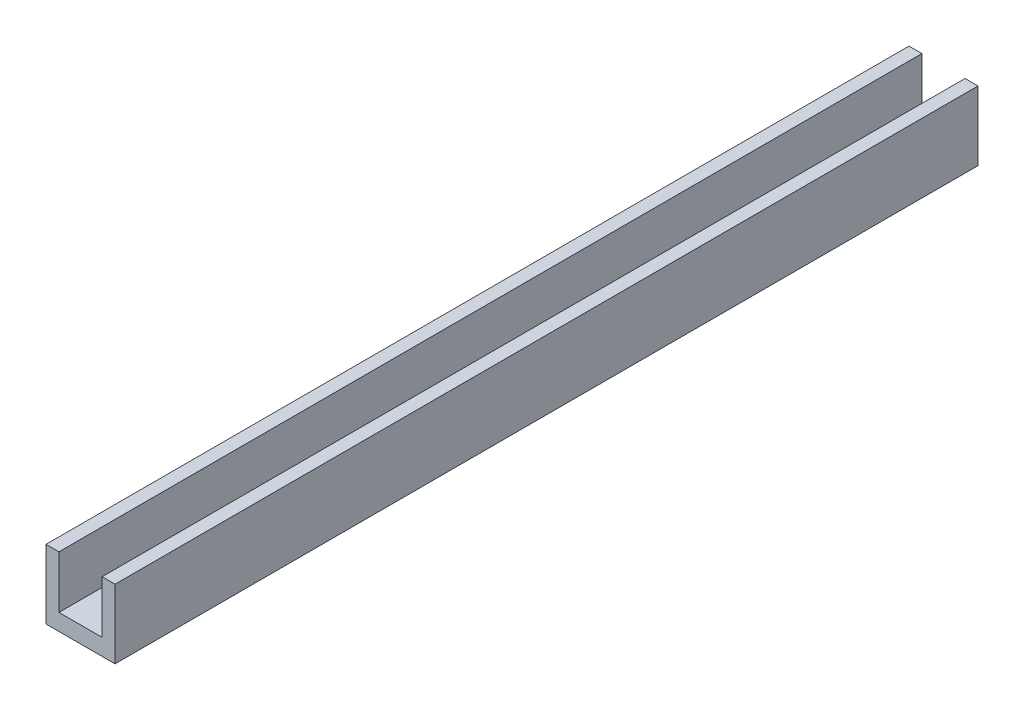
ISO-10303-21;
HEADER;
FILE_DESCRIPTION(('STEP AP214'),'2;1');
FILE_NAME('part.step','',(''),(''),'','','');
FILE_SCHEMA(('AUTOMOTIVE_DESIGN { 1 0 10303 214 1 1 1 1 }'));
ENDSEC;
DATA;
#1=APPLICATION_CONTEXT('core data for automotive mechanical design processes');
#2=APPLICATION_PROTOCOL_DEFINITION('international standard','automotive_design',2000,#1);
#3=PRODUCT_CONTEXT('',#1,'mechanical');
#4=PRODUCT('Part','Part','',(#3));
#5=PRODUCT_RELATED_PRODUCT_CATEGORY('part','',(#4));
#6=PRODUCT_DEFINITION_FORMATION('','',#4);
#7=PRODUCT_DEFINITION_CONTEXT('part definition',#1,'design');
#8=PRODUCT_DEFINITION('design','',#6,#7);
#9=PRODUCT_DEFINITION_SHAPE('','',#8);
#10=(LENGTH_UNIT() NAMED_UNIT(*) SI_UNIT(.MILLI.,.METRE.));
#11=(NAMED_UNIT(*) PLANE_ANGLE_UNIT() SI_UNIT($,.RADIAN.));
#12=(NAMED_UNIT(*) SI_UNIT($,.STERADIAN.) SOLID_ANGLE_UNIT());
#13=UNCERTAINTY_MEASURE_WITH_UNIT(LENGTH_MEASURE(1.E-05),#10,'distance_accuracy_value','');
#14=(GEOMETRIC_REPRESENTATION_CONTEXT(3) GLOBAL_UNCERTAINTY_ASSIGNED_CONTEXT((#13)) GLOBAL_UNIT_ASSIGNED_CONTEXT((#10,
#11,#12)) REPRESENTATION_CONTEXT('',''));
#15=CARTESIAN_POINT('',(0.,0.,0.));
#16=DIRECTION('',(0.,0.,1.));
#17=DIRECTION('',(1.,0.,0.));
#18=AXIS2_PLACEMENT_3D('',#15,#16,#17);
#19=CARTESIAN_POINT('',(0.,80.,1000.));
#20=DIRECTION('',(0.,-1.,0.));
#21=DIRECTION('',(0.,0.,-1.));
#22=AXIS2_PLACEMENT_3D('',#19,#20,#21);
#23=PLANE('',#22);
#24=DIRECTION('',(-1.,0.,0.));
#25=VECTOR('',#24,1.);
#26=CARTESIAN_POINT('',(0.,80.,1000.));
#27=LINE('',#26,#25);
#28=CARTESIAN_POINT('',(15.,80.,1000.));
#29=VERTEX_POINT('',#28);
#30=CARTESIAN_POINT('',(0.,80.,1000.));
#31=VERTEX_POINT('',#30);
#32=EDGE_CURVE('E167',#29,#31,#27,.T.);
#33=ORIENTED_EDGE('',*,*,#32,.F.);
#34=DIRECTION('',(0.,0.,1.));
#35=VECTOR('',#34,1.);
#36=CARTESIAN_POINT('',(15.,80.,0.));
#37=LINE('',#36,#35);
#38=CARTESIAN_POINT('',(15.,80.,0.));
#39=VERTEX_POINT('',#38);
#40=EDGE_CURVE('E155',#39,#29,#37,.T.);
#41=ORIENTED_EDGE('',*,*,#40,.F.);
#42=DIRECTION('',(-1.,0.,0.));
#43=VECTOR('',#42,1.);
#44=CARTESIAN_POINT('',(0.,80.,0.));
#45=LINE('',#44,#43);
#46=CARTESIAN_POINT('',(0.,80.,0.));
#47=VERTEX_POINT('',#46);
#48=EDGE_CURVE('E141',#39,#47,#45,.T.);
#49=ORIENTED_EDGE('',*,*,#48,.T.);
#50=DIRECTION('',(0.,0.,-1.));
#51=VECTOR('',#50,1.);
#52=CARTESIAN_POINT('',(0.,80.,1000.));
#53=LINE('',#52,#51);
#54=EDGE_CURVE('E52',#31,#47,#53,.T.);
#55=ORIENTED_EDGE('',*,*,#54,.F.);
#56=EDGE_LOOP('',(#33,#41,#49,#55));
#57=FACE_BOUND('',#56,.T.);
#58=ADVANCED_FACE('F43',(#57),#23,.F.);
#59=CARTESIAN_POINT('',(80.,80.,1000.));
#60=DIRECTION('',(-1.,0.,0.));
#61=DIRECTION('',(0.,0.,1.));
#62=AXIS2_PLACEMENT_3D('',#59,#60,#61);
#63=PLANE('',#62);
#64=DIRECTION('',(0.,1.,0.));
#65=VECTOR('',#64,1.);
#66=CARTESIAN_POINT('',(80.,80.,0.));
#67=LINE('',#66,#65);
#68=CARTESIAN_POINT('',(80.,0.,0.));
#69=VERTEX_POINT('',#68);
#70=CARTESIAN_POINT('',(80.,80.,0.));
#71=VERTEX_POINT('',#70);
#72=EDGE_CURVE('E158',#69,#71,#67,.T.);
#73=ORIENTED_EDGE('',*,*,#72,.T.);
#74=DIRECTION('',(0.,0.,-1.));
#75=VECTOR('',#74,1.);
#76=CARTESIAN_POINT('',(80.,80.,1000.));
#77=LINE('',#76,#75);
#78=CARTESIAN_POINT('',(80.,80.,1000.));
#79=VERTEX_POINT('',#78);
#80=EDGE_CURVE('E11',#79,#71,#77,.T.);
#81=ORIENTED_EDGE('',*,*,#80,.F.);
#82=DIRECTION('',(0.,1.,0.));
#83=VECTOR('',#82,1.);
#84=CARTESIAN_POINT('',(80.,80.,1000.));
#85=LINE('',#84,#83);
#86=CARTESIAN_POINT('',(80.,0.,1000.));
#87=VERTEX_POINT('',#86);
#88=EDGE_CURVE('E164',#87,#79,#85,.T.);
#89=ORIENTED_EDGE('',*,*,#88,.F.);
#90=DIRECTION('',(0.,0.,-1.));
#91=VECTOR('',#90,1.);
#92=CARTESIAN_POINT('',(80.,0.,1000.));
#93=LINE('',#92,#91);
#94=EDGE_CURVE('E175',#87,#69,#93,.T.);
#95=ORIENTED_EDGE('',*,*,#94,.T.);
#96=EDGE_LOOP('',(#73,#81,#89,#95));
#97=FACE_BOUND('',#96,.T.);
#98=ADVANCED_FACE('F45',(#97),#63,.F.);
#99=CARTESIAN_POINT('',(65.,80.,0.));
#100=VERTEX_POINT('',#99);
#101=EDGE_CURVE('E179',#71,#100,#45,.T.);
#102=ORIENTED_EDGE('',*,*,#101,.T.);
#103=DIRECTION('',(0.,0.,1.));
#104=VECTOR('',#103,1.);
#105=CARTESIAN_POINT('',(65.,80.,0.));
#106=LINE('',#105,#104);
#107=CARTESIAN_POINT('',(65.,80.,1000.));
#108=VERTEX_POINT('',#107);
#109=EDGE_CURVE('E159',#100,#108,#106,.T.);
#110=ORIENTED_EDGE('',*,*,#109,.T.);
#111=EDGE_CURVE('E96',#79,#108,#27,.T.);
#112=ORIENTED_EDGE('',*,*,#111,.F.);
#113=ORIENTED_EDGE('',*,*,#80,.T.);
#114=EDGE_LOOP('',(#102,#110,#112,#113));
#115=FACE_BOUND('',#114,.T.);
#116=ADVANCED_FACE('F214',(#115),#23,.F.);
#117=CARTESIAN_POINT('',(0.,80.,1000.));
#118=DIRECTION('',(1.,0.,0.));
#119=DIRECTION('',(0.,1.,0.));
#120=AXIS2_PLACEMENT_3D('',#117,#118,#119);
#121=PLANE('',#120);
#122=DIRECTION('',(0.,-1.,0.));
#123=VECTOR('',#122,1.);
#124=CARTESIAN_POINT('',(0.,80.,0.));
#125=LINE('',#124,#123);
#126=CARTESIAN_POINT('',(0.,0.,0.));
#127=VERTEX_POINT('',#126);
#128=EDGE_CURVE('E183',#47,#127,#125,.T.);
#129=ORIENTED_EDGE('',*,*,#128,.T.);
#130=DIRECTION('',(0.,0.,-1.));
#131=VECTOR('',#130,1.);
#132=CARTESIAN_POINT('',(0.,0.,1000.));
#133=LINE('',#132,#131);
#134=CARTESIAN_POINT('',(0.,0.,1000.));
#135=VERTEX_POINT('',#134);
#136=EDGE_CURVE('E190',#135,#127,#133,.T.);
#137=ORIENTED_EDGE('',*,*,#136,.F.);
#138=DIRECTION('',(0.,-1.,0.));
#139=VECTOR('',#138,1.);
#140=CARTESIAN_POINT('',(0.,80.,1000.));
#141=LINE('',#140,#139);
#142=EDGE_CURVE('E170',#31,#135,#141,.T.);
#143=ORIENTED_EDGE('',*,*,#142,.F.);
#144=ORIENTED_EDGE('',*,*,#54,.T.);
#145=EDGE_LOOP('',(#129,#137,#143,#144));
#146=FACE_BOUND('',#145,.T.);
#147=ADVANCED_FACE('F197',(#146),#121,.F.);
#148=CARTESIAN_POINT('',(0.,0.,1000.));
#149=DIRECTION('',(0.,1.,0.));
#150=DIRECTION('',(0.,0.,1.));
#151=AXIS2_PLACEMENT_3D('',#148,#149,#150);
#152=PLANE('',#151);
#153=DIRECTION('',(1.,0.,0.));
#154=VECTOR('',#153,1.);
#155=CARTESIAN_POINT('',(0.,0.,0.));
#156=LINE('',#155,#154);
#157=EDGE_CURVE('E89',#127,#69,#156,.T.);
#158=ORIENTED_EDGE('',*,*,#157,.T.);
#159=ORIENTED_EDGE('',*,*,#94,.F.);
#160=DIRECTION('',(1.,0.,0.));
#161=VECTOR('',#160,1.);
#162=CARTESIAN_POINT('',(0.,0.,1000.));
#163=LINE('',#162,#161);
#164=EDGE_CURVE('E68',#135,#87,#163,.T.);
#165=ORIENTED_EDGE('',*,*,#164,.F.);
#166=ORIENTED_EDGE('',*,*,#136,.T.);
#167=EDGE_LOOP('',(#158,#159,#165,#166));
#168=FACE_BOUND('',#167,.T.);
#169=ADVANCED_FACE('F205',(#168),#152,.F.);
#170=CARTESIAN_POINT('',(0.,0.,1000.));
#171=DIRECTION('',(0.,0.,1.));
#172=DIRECTION('',(1.,0.,0.));
#173=AXIS2_PLACEMENT_3D('',#170,#171,#172);
#174=PLANE('',#173);
#175=DIRECTION('',(0.,-1.,0.));
#176=VECTOR('',#175,1.);
#177=CARTESIAN_POINT('',(15.,80.,1000.));
#178=LINE('',#177,#176);
#179=CARTESIAN_POINT('',(15.,19.1659040109674,1000.));
#180=VERTEX_POINT('',#179);
#181=EDGE_CURVE('E125',#29,#180,#178,.T.);
#182=ORIENTED_EDGE('',*,*,#181,.F.);
#183=ORIENTED_EDGE('',*,*,#32,.T.);
#184=ORIENTED_EDGE('',*,*,#142,.T.);
#185=ORIENTED_EDGE('',*,*,#164,.T.);
#186=ORIENTED_EDGE('',*,*,#88,.T.);
#187=ORIENTED_EDGE('',*,*,#111,.T.);
#188=DIRECTION('',(0.,1.,0.));
#189=VECTOR('',#188,1.);
#190=CARTESIAN_POINT('',(65.,80.,1000.));
#191=LINE('',#190,#189);
#192=CARTESIAN_POINT('',(65.,19.1659040109674,1000.));
#193=VERTEX_POINT('',#192);
#194=EDGE_CURVE('E143',#193,#108,#191,.T.);
#195=ORIENTED_EDGE('',*,*,#194,.F.);
#196=DIRECTION('',(1.,0.,0.));
#197=VECTOR('',#196,1.);
#198=CARTESIAN_POINT('',(15.,19.1659040109674,1000.));
#199=LINE('',#198,#197);
#200=EDGE_CURVE('E146',#180,#193,#199,.T.);
#201=ORIENTED_EDGE('',*,*,#200,.F.);
#202=EDGE_LOOP('',(#182,#183,#184,#185,#186,#187,#195,#201));
#203=FACE_BOUND('',#202,.T.);
#204=ADVANCED_FACE('F207',(#203),#174,.T.);
#205=CARTESIAN_POINT('',(0.,0.,0.));
#206=DIRECTION('',(0.,0.,1.));
#207=DIRECTION('',(1.,0.,0.));
#208=AXIS2_PLACEMENT_3D('',#205,#206,#207);
#209=PLANE('',#208);
#210=ORIENTED_EDGE('',*,*,#48,.F.);
#211=DIRECTION('',(0.,-1.,0.));
#212=VECTOR('',#211,1.);
#213=CARTESIAN_POINT('',(15.,80.,0.));
#214=LINE('',#213,#212);
#215=CARTESIAN_POINT('',(15.,19.1659040109674,0.));
#216=VERTEX_POINT('',#215);
#217=EDGE_CURVE('E122',#39,#216,#214,.T.);
#218=ORIENTED_EDGE('',*,*,#217,.T.);
#219=DIRECTION('',(1.,0.,0.));
#220=VECTOR('',#219,1.);
#221=CARTESIAN_POINT('',(15.,19.1659040109674,0.));
#222=LINE('',#221,#220);
#223=CARTESIAN_POINT('',(65.,19.1659040109674,0.));
#224=VERTEX_POINT('',#223);
#225=EDGE_CURVE('E133',#216,#224,#222,.T.);
#226=ORIENTED_EDGE('',*,*,#225,.T.);
#227=DIRECTION('',(0.,1.,0.));
#228=VECTOR('',#227,1.);
#229=CARTESIAN_POINT('',(65.,80.,0.));
#230=LINE('',#229,#228);
#231=EDGE_CURVE('E59',#224,#100,#230,.T.);
#232=ORIENTED_EDGE('',*,*,#231,.T.);
#233=ORIENTED_EDGE('',*,*,#101,.F.);
#234=ORIENTED_EDGE('',*,*,#72,.F.);
#235=ORIENTED_EDGE('',*,*,#157,.F.);
#236=ORIENTED_EDGE('',*,*,#128,.F.);
#237=EDGE_LOOP('',(#210,#218,#226,#232,#233,#234,#235,#236));
#238=FACE_BOUND('',#237,.T.);
#239=ADVANCED_FACE('F139',(#238),#209,.F.);
#240=CARTESIAN_POINT('',(15.,80.,0.));
#241=DIRECTION('',(-1.,0.,0.));
#242=DIRECTION('',(0.,-1.,0.));
#243=AXIS2_PLACEMENT_3D('',#240,#241,#242);
#244=PLANE('',#243);
#245=ORIENTED_EDGE('',*,*,#181,.T.);
#246=DIRECTION('',(0.,0.,1.));
#247=VECTOR('',#246,1.);
#248=CARTESIAN_POINT('',(15.,19.1659040109674,0.));
#249=LINE('',#248,#247);
#250=EDGE_CURVE('E118',#216,#180,#249,.T.);
#251=ORIENTED_EDGE('',*,*,#250,.F.);
#252=ORIENTED_EDGE('',*,*,#217,.F.);
#253=ORIENTED_EDGE('',*,*,#40,.T.);
#254=EDGE_LOOP('',(#245,#251,#252,#253));
#255=FACE_BOUND('',#254,.T.);
#256=ADVANCED_FACE('F120',(#255),#244,.F.);
#257=CARTESIAN_POINT('',(65.,80.,0.));
#258=DIRECTION('',(1.,0.,0.));
#259=DIRECTION('',(0.,1.,0.));
#260=AXIS2_PLACEMENT_3D('',#257,#258,#259);
#261=PLANE('',#260);
#262=ORIENTED_EDGE('',*,*,#194,.T.);
#263=ORIENTED_EDGE('',*,*,#109,.F.);
#264=ORIENTED_EDGE('',*,*,#231,.F.);
#265=DIRECTION('',(0.,0.,1.));
#266=VECTOR('',#265,1.);
#267=CARTESIAN_POINT('',(65.,19.1659040109674,0.));
#268=LINE('',#267,#266);
#269=EDGE_CURVE('E130',#224,#193,#268,.T.);
#270=ORIENTED_EDGE('',*,*,#269,.T.);
#271=EDGE_LOOP('',(#262,#263,#264,#270));
#272=FACE_BOUND('',#271,.T.);
#273=ADVANCED_FACE('F225',(#272),#261,.F.);
#274=CARTESIAN_POINT('',(15.,19.1659040109674,0.));
#275=DIRECTION('',(0.,-1.,0.));
#276=DIRECTION('',(0.,0.,-1.));
#277=AXIS2_PLACEMENT_3D('',#274,#275,#276);
#278=PLANE('',#277);
#279=ORIENTED_EDGE('',*,*,#200,.T.);
#280=ORIENTED_EDGE('',*,*,#269,.F.);
#281=ORIENTED_EDGE('',*,*,#225,.F.);
#282=ORIENTED_EDGE('',*,*,#250,.T.);
#283=EDGE_LOOP('',(#279,#280,#281,#282));
#284=FACE_BOUND('',#283,.T.);
#285=ADVANCED_FACE('F134',(#284),#278,.F.);
#286=CLOSED_SHELL('',(#58,#98,#116,#147,#169,#204,#239,#256,#273,#285));
#287=MANIFOLD_SOLID_BREP('B2',#286);
#288=ADVANCED_BREP_SHAPE_REPRESENTATION('',(#18,#287),#14);
#289=SHAPE_DEFINITION_REPRESENTATION(#9,#288);
ENDSEC;
END-ISO-10303-21;
